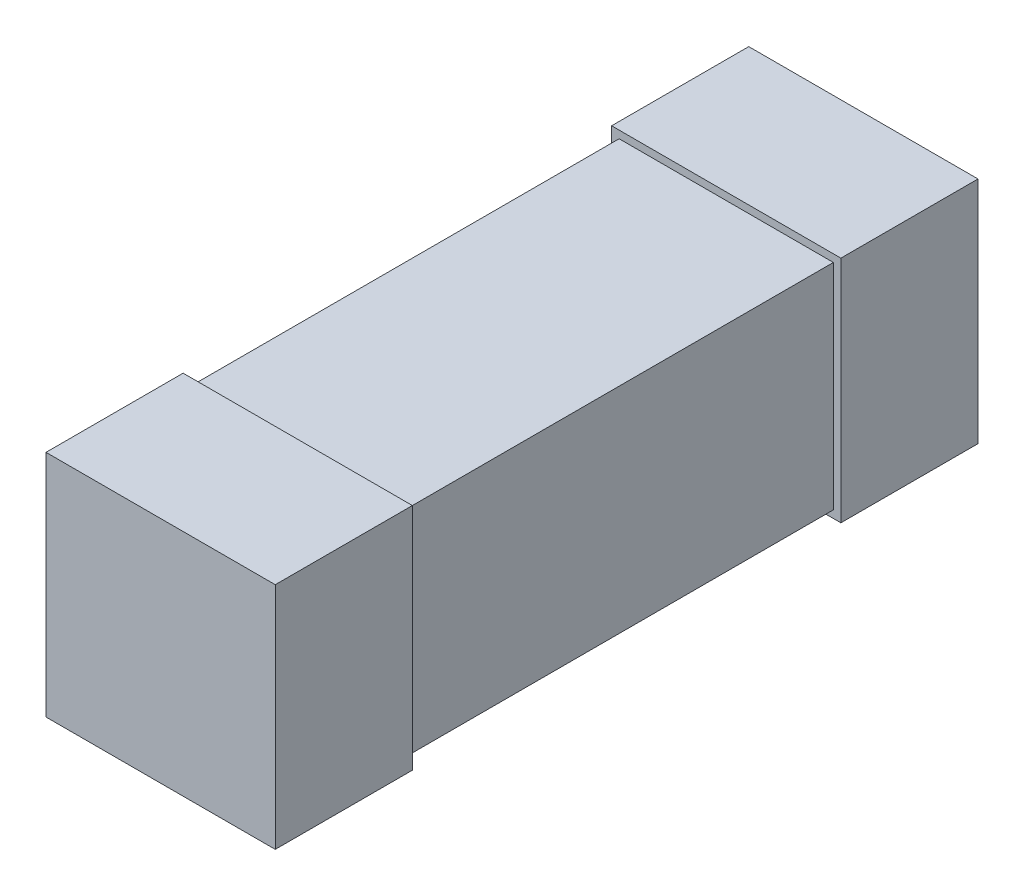
ISO-10303-21;
HEADER;
FILE_DESCRIPTION(('STEP AP214'),'2;1');
FILE_NAME('part.step','',(''),(''),'','','');
FILE_SCHEMA(('AUTOMOTIVE_DESIGN { 1 0 10303 214 1 1 1 1 }'));
ENDSEC;
DATA;
#1=APPLICATION_CONTEXT('core data for automotive mechanical design processes');
#2=APPLICATION_PROTOCOL_DEFINITION('international standard','automotive_design',2000,#1);
#3=PRODUCT_CONTEXT('',#1,'mechanical');
#4=PRODUCT('Part','Part','',(#3));
#5=PRODUCT_RELATED_PRODUCT_CATEGORY('part','',(#4));
#6=PRODUCT_DEFINITION_FORMATION('','',#4);
#7=PRODUCT_DEFINITION_CONTEXT('part definition',#1,'design');
#8=PRODUCT_DEFINITION('design','',#6,#7);
#9=PRODUCT_DEFINITION_SHAPE('','',#8);
#10=(LENGTH_UNIT() NAMED_UNIT(*) SI_UNIT(.MILLI.,.METRE.));
#11=(NAMED_UNIT(*) PLANE_ANGLE_UNIT() SI_UNIT($,.RADIAN.));
#12=(NAMED_UNIT(*) SI_UNIT($,.STERADIAN.) SOLID_ANGLE_UNIT());
#13=UNCERTAINTY_MEASURE_WITH_UNIT(LENGTH_MEASURE(1.E-05),#10,'distance_accuracy_value','');
#14=(GEOMETRIC_REPRESENTATION_CONTEXT(3) GLOBAL_UNCERTAINTY_ASSIGNED_CONTEXT((#13)) GLOBAL_UNIT_ASSIGNED_CONTEXT((#10,
#11,#12)) REPRESENTATION_CONTEXT('',''));
#15=CARTESIAN_POINT('',(0.,0.,0.));
#16=DIRECTION('',(0.,0.,1.));
#17=DIRECTION('',(1.,0.,0.));
#18=AXIS2_PLACEMENT_3D('',#15,#16,#17);
#19=CARTESIAN_POINT('',(0.,0.,3.2));
#20=DIRECTION('',(0.,0.,1.));
#21=DIRECTION('',(1.,0.,0.));
#22=AXIS2_PLACEMENT_3D('',#19,#20,#21);
#23=PLANE('',#22);
#24=DIRECTION('',(0.,1.,0.));
#25=VECTOR('',#24,1.);
#26=CARTESIAN_POINT('',(0.,0.,3.2));
#27=LINE('',#26,#25);
#28=CARTESIAN_POINT('',(0.,0.,3.2));
#29=VERTEX_POINT('',#28);
#30=CARTESIAN_POINT('',(0.,5.35,3.2));
#31=VERTEX_POINT('',#30);
#32=EDGE_CURVE('E192',#29,#31,#27,.T.);
#33=ORIENTED_EDGE('',*,*,#32,.T.);
#34=DIRECTION('',(-1.,0.,0.));
#35=VECTOR('',#34,1.);
#36=CARTESIAN_POINT('',(0.,5.35,3.2));
#37=LINE('',#36,#35);
#38=CARTESIAN_POINT('',(-5.35,5.35,3.2));
#39=VERTEX_POINT('',#38);
#40=EDGE_CURVE('E85',#31,#39,#37,.T.);
#41=ORIENTED_EDGE('',*,*,#40,.T.);
#42=DIRECTION('',(0.,-1.,0.));
#43=VECTOR('',#42,1.);
#44=CARTESIAN_POINT('',(-5.35,0.,3.2));
#45=LINE('',#44,#43);
#46=CARTESIAN_POINT('',(-5.35,0.,3.2));
#47=VERTEX_POINT('',#46);
#48=EDGE_CURVE('E195',#39,#47,#45,.T.);
#49=ORIENTED_EDGE('',*,*,#48,.T.);
#50=DIRECTION('',(1.,0.,0.));
#51=VECTOR('',#50,1.);
#52=CARTESIAN_POINT('',(0.,0.,3.2));
#53=LINE('',#52,#51);
#54=EDGE_CURVE('E57',#47,#29,#53,.T.);
#55=ORIENTED_EDGE('',*,*,#54,.T.);
#56=EDGE_LOOP('',(#33,#41,#49,#55));
#57=FACE_BOUND('',#56,.T.);
#58=DIRECTION('',(1.,0.,0.));
#59=VECTOR('',#58,1.);
#60=CARTESIAN_POINT('',(-0.174999999999999,0.174999999999999,3.2));
#61=LINE('',#60,#59);
#62=CARTESIAN_POINT('',(-5.175,0.174999999999998,3.2));
#63=VERTEX_POINT('',#62);
#64=CARTESIAN_POINT('',(-0.174999999999999,0.174999999999999,3.2));
#65=VERTEX_POINT('',#64);
#66=EDGE_CURVE('E159',#63,#65,#61,.T.);
#67=ORIENTED_EDGE('',*,*,#66,.F.);
#68=DIRECTION('',(0.,-1.,0.));
#69=VECTOR('',#68,1.);
#70=CARTESIAN_POINT('',(-5.175,5.175,3.2));
#71=LINE('',#70,#69);
#72=CARTESIAN_POINT('',(-5.175,5.175,3.2));
#73=VERTEX_POINT('',#72);
#74=EDGE_CURVE('E156',#73,#63,#71,.T.);
#75=ORIENTED_EDGE('',*,*,#74,.F.);
#76=DIRECTION('',(-1.,0.,0.));
#77=VECTOR('',#76,1.);
#78=CARTESIAN_POINT('',(-0.174999999999999,5.175,3.2));
#79=LINE('',#78,#77);
#80=CARTESIAN_POINT('',(-0.174999999999999,5.175,3.2));
#81=VERTEX_POINT('',#80);
#82=EDGE_CURVE('E169',#81,#73,#79,.T.);
#83=ORIENTED_EDGE('',*,*,#82,.F.);
#84=DIRECTION('',(0.,1.,0.));
#85=VECTOR('',#84,1.);
#86=CARTESIAN_POINT('',(-0.174999999999999,5.175,3.2));
#87=LINE('',#86,#85);
#88=EDGE_CURVE('E180',#65,#81,#87,.T.);
#89=ORIENTED_EDGE('',*,*,#88,.F.);
#90=EDGE_LOOP('',(#67,#75,#83,#89));
#91=FACE_BOUND('',#90,.T.);
#92=ADVANCED_FACE('F33',(#57,#91),#23,.T.);
#93=CARTESIAN_POINT('',(0.,0.,3.2));
#94=DIRECTION('',(-1.,0.,0.));
#95=DIRECTION('',(0.,0.,1.));
#96=AXIS2_PLACEMENT_3D('',#93,#94,#95);
#97=PLANE('',#96);
#98=DIRECTION('',(0.,1.,0.));
#99=VECTOR('',#98,1.);
#100=CARTESIAN_POINT('',(0.,0.,0.));
#101=LINE('',#100,#99);
#102=CARTESIAN_POINT('',(0.,0.,0.));
#103=VERTEX_POINT('',#102);
#104=CARTESIAN_POINT('',(0.,5.35,0.));
#105=VERTEX_POINT('',#104);
#106=EDGE_CURVE('E191',#103,#105,#101,.T.);
#107=ORIENTED_EDGE('',*,*,#106,.T.);
#108=DIRECTION('',(0.,0.,-1.));
#109=VECTOR('',#108,1.);
#110=CARTESIAN_POINT('',(0.,5.35,3.2));
#111=LINE('',#110,#109);
#112=EDGE_CURVE('E11',#31,#105,#111,.T.);
#113=ORIENTED_EDGE('',*,*,#112,.F.);
#114=ORIENTED_EDGE('',*,*,#32,.F.);
#115=DIRECTION('',(0.,0.,-1.));
#116=VECTOR('',#115,1.);
#117=CARTESIAN_POINT('',(0.,0.,3.2));
#118=LINE('',#117,#116);
#119=EDGE_CURVE('E198',#29,#103,#118,.T.);
#120=ORIENTED_EDGE('',*,*,#119,.T.);
#121=EDGE_LOOP('',(#107,#113,#114,#120));
#122=FACE_BOUND('',#121,.T.);
#123=ADVANCED_FACE('F35',(#122),#97,.F.);
#124=CARTESIAN_POINT('',(0.,5.35,3.2));
#125=DIRECTION('',(0.,-1.,0.));
#126=DIRECTION('',(0.,0.,-1.));
#127=AXIS2_PLACEMENT_3D('',#124,#125,#126);
#128=PLANE('',#127);
#129=DIRECTION('',(-1.,0.,0.));
#130=VECTOR('',#129,1.);
#131=CARTESIAN_POINT('',(0.,5.35,0.));
#132=LINE('',#131,#130);
#133=CARTESIAN_POINT('',(-5.35,5.35,0.));
#134=VERTEX_POINT('',#133);
#135=EDGE_CURVE('E201',#105,#134,#132,.T.);
#136=ORIENTED_EDGE('',*,*,#135,.T.);
#137=DIRECTION('',(0.,0.,-1.));
#138=VECTOR('',#137,1.);
#139=CARTESIAN_POINT('',(-5.35,5.35,3.2));
#140=LINE('',#139,#138);
#141=EDGE_CURVE('E41',#39,#134,#140,.T.);
#142=ORIENTED_EDGE('',*,*,#141,.F.);
#143=ORIENTED_EDGE('',*,*,#40,.F.);
#144=ORIENTED_EDGE('',*,*,#112,.T.);
#145=EDGE_LOOP('',(#136,#142,#143,#144));
#146=FACE_BOUND('',#145,.T.);
#147=ADVANCED_FACE('F229',(#146),#128,.F.);
#148=CARTESIAN_POINT('',(-5.35,0.,3.2));
#149=DIRECTION('',(1.,0.,0.));
#150=DIRECTION('',(0.,0.,-1.));
#151=AXIS2_PLACEMENT_3D('',#148,#149,#150);
#152=PLANE('',#151);
#153=DIRECTION('',(0.,-1.,0.));
#154=VECTOR('',#153,1.);
#155=CARTESIAN_POINT('',(-5.35,0.,0.));
#156=LINE('',#155,#154);
#157=CARTESIAN_POINT('',(-5.35,0.,0.));
#158=VERTEX_POINT('',#157);
#159=EDGE_CURVE('E203',#134,#158,#156,.T.);
#160=ORIENTED_EDGE('',*,*,#159,.T.);
#161=DIRECTION('',(0.,0.,-1.));
#162=VECTOR('',#161,1.);
#163=CARTESIAN_POINT('',(-5.35,0.,3.2));
#164=LINE('',#163,#162);
#165=EDGE_CURVE('E207',#47,#158,#164,.T.);
#166=ORIENTED_EDGE('',*,*,#165,.F.);
#167=ORIENTED_EDGE('',*,*,#48,.F.);
#168=ORIENTED_EDGE('',*,*,#141,.T.);
#169=EDGE_LOOP('',(#160,#166,#167,#168));
#170=FACE_BOUND('',#169,.T.);
#171=ADVANCED_FACE('F212',(#170),#152,.F.);
#172=CARTESIAN_POINT('',(0.,0.,3.2));
#173=DIRECTION('',(0.,1.,0.));
#174=DIRECTION('',(-1.,0.,0.));
#175=AXIS2_PLACEMENT_3D('',#172,#173,#174);
#176=PLANE('',#175);
#177=DIRECTION('',(1.,0.,0.));
#178=VECTOR('',#177,1.);
#179=CARTESIAN_POINT('',(0.,0.,0.));
#180=LINE('',#179,#178);
#181=EDGE_CURVE('E78',#158,#103,#180,.T.);
#182=ORIENTED_EDGE('',*,*,#181,.T.);
#183=ORIENTED_EDGE('',*,*,#119,.F.);
#184=ORIENTED_EDGE('',*,*,#54,.F.);
#185=ORIENTED_EDGE('',*,*,#165,.T.);
#186=EDGE_LOOP('',(#182,#183,#184,#185));
#187=FACE_BOUND('',#186,.T.);
#188=ADVANCED_FACE('F220',(#187),#176,.F.);
#189=CARTESIAN_POINT('',(0.,0.,0.));
#190=DIRECTION('',(0.,0.,1.));
#191=DIRECTION('',(1.,0.,0.));
#192=AXIS2_PLACEMENT_3D('',#189,#190,#191);
#193=PLANE('',#192);
#194=ORIENTED_EDGE('',*,*,#106,.F.);
#195=ORIENTED_EDGE('',*,*,#181,.F.);
#196=ORIENTED_EDGE('',*,*,#159,.F.);
#197=ORIENTED_EDGE('',*,*,#135,.F.);
#198=EDGE_LOOP('',(#194,#195,#196,#197));
#199=FACE_BOUND('',#198,.T.);
#200=ADVANCED_FACE('F216',(#199),#193,.F.);
#201=CARTESIAN_POINT('',(-5.175,5.175,13.2));
#202=DIRECTION('',(1.,0.,0.));
#203=DIRECTION('',(0.,0.,-1.));
#204=AXIS2_PLACEMENT_3D('',#201,#202,#203);
#205=PLANE('',#204);
#206=ORIENTED_EDGE('',*,*,#74,.T.);
#207=DIRECTION('',(0.,0.,-1.));
#208=VECTOR('',#207,1.);
#209=CARTESIAN_POINT('',(-5.175,0.174999999999998,13.2));
#210=LINE('',#209,#208);
#211=CARTESIAN_POINT('',(-5.175,0.174999999999998,13.2));
#212=VERTEX_POINT('',#211);
#213=EDGE_CURVE('E189',#212,#63,#210,.T.);
#214=ORIENTED_EDGE('',*,*,#213,.F.);
#215=DIRECTION('',(0.,-1.,0.));
#216=VECTOR('',#215,1.);
#217=CARTESIAN_POINT('',(-5.175,5.175,13.2));
#218=LINE('',#217,#216);
#219=CARTESIAN_POINT('',(-5.175,5.175,13.2));
#220=VERTEX_POINT('',#219);
#221=EDGE_CURVE('E165',#220,#212,#218,.T.);
#222=ORIENTED_EDGE('',*,*,#221,.F.);
#223=DIRECTION('',(0.,0.,-1.));
#224=VECTOR('',#223,1.);
#225=CARTESIAN_POINT('',(-5.175,5.175,13.2));
#226=LINE('',#225,#224);
#227=EDGE_CURVE('E177',#220,#73,#226,.T.);
#228=ORIENTED_EDGE('',*,*,#227,.T.);
#229=EDGE_LOOP('',(#206,#214,#222,#228));
#230=FACE_BOUND('',#229,.T.);
#231=ADVANCED_FACE('F227',(#230),#205,.F.);
#232=CARTESIAN_POINT('',(-0.174999999999999,0.174999999999999,13.2));
#233=DIRECTION('',(0.,1.,0.));
#234=DIRECTION('',(-1.,0.,0.));
#235=AXIS2_PLACEMENT_3D('',#232,#233,#234);
#236=PLANE('',#235);
#237=ORIENTED_EDGE('',*,*,#66,.T.);
#238=DIRECTION('',(0.,0.,-1.));
#239=VECTOR('',#238,1.);
#240=CARTESIAN_POINT('',(-0.174999999999999,0.174999999999999,13.2));
#241=LINE('',#240,#239);
#242=CARTESIAN_POINT('',(-0.174999999999999,0.174999999999999,13.2));
#243=VERTEX_POINT('',#242);
#244=EDGE_CURVE('E186',#243,#65,#241,.T.);
#245=ORIENTED_EDGE('',*,*,#244,.F.);
#246=DIRECTION('',(1.,0.,0.));
#247=VECTOR('',#246,1.);
#248=CARTESIAN_POINT('',(-0.174999999999999,0.174999999999999,13.2));
#249=LINE('',#248,#247);
#250=EDGE_CURVE('E168',#212,#243,#249,.T.);
#251=ORIENTED_EDGE('',*,*,#250,.F.);
#252=ORIENTED_EDGE('',*,*,#213,.T.);
#253=EDGE_LOOP('',(#237,#245,#251,#252));
#254=FACE_BOUND('',#253,.T.);
#255=ADVANCED_FACE('F240',(#254),#236,.F.);
#256=CARTESIAN_POINT('',(-0.174999999999999,5.175,13.2));
#257=DIRECTION('',(-1.,0.,0.));
#258=DIRECTION('',(0.,-1.,0.));
#259=AXIS2_PLACEMENT_3D('',#256,#257,#258);
#260=PLANE('',#259);
#261=ORIENTED_EDGE('',*,*,#88,.T.);
#262=DIRECTION('',(0.,0.,-1.));
#263=VECTOR('',#262,1.);
#264=CARTESIAN_POINT('',(-0.174999999999999,5.175,13.2));
#265=LINE('',#264,#263);
#266=CARTESIAN_POINT('',(-0.174999999999999,5.175,13.2));
#267=VERTEX_POINT('',#266);
#268=EDGE_CURVE('E48',#267,#81,#265,.T.);
#269=ORIENTED_EDGE('',*,*,#268,.F.);
#270=DIRECTION('',(0.,1.,0.));
#271=VECTOR('',#270,1.);
#272=CARTESIAN_POINT('',(-0.174999999999999,5.175,13.2));
#273=LINE('',#272,#271);
#274=EDGE_CURVE('E172',#243,#267,#273,.T.);
#275=ORIENTED_EDGE('',*,*,#274,.F.);
#276=ORIENTED_EDGE('',*,*,#244,.T.);
#277=EDGE_LOOP('',(#261,#269,#275,#276));
#278=FACE_BOUND('',#277,.T.);
#279=ADVANCED_FACE('F244',(#278),#260,.F.);
#280=CARTESIAN_POINT('',(-0.174999999999999,5.175,13.2));
#281=DIRECTION('',(0.,-1.,0.));
#282=DIRECTION('',(1.,0.,0.));
#283=AXIS2_PLACEMENT_3D('',#280,#281,#282);
#284=PLANE('',#283);
#285=ORIENTED_EDGE('',*,*,#82,.T.);
#286=ORIENTED_EDGE('',*,*,#227,.F.);
#287=DIRECTION('',(-1.,0.,0.));
#288=VECTOR('',#287,1.);
#289=CARTESIAN_POINT('',(-0.174999999999999,5.175,13.2));
#290=LINE('',#289,#288);
#291=EDGE_CURVE('E175',#267,#220,#290,.T.);
#292=ORIENTED_EDGE('',*,*,#291,.F.);
#293=ORIENTED_EDGE('',*,*,#268,.T.);
#294=EDGE_LOOP('',(#285,#286,#292,#293));
#295=FACE_BOUND('',#294,.T.);
#296=ADVANCED_FACE('F248',(#295),#284,.F.);
#297=CARTESIAN_POINT('',(0.,0.,13.2));
#298=DIRECTION('',(0.,0.,-1.));
#299=DIRECTION('',(-1.,0.,0.));
#300=AXIS2_PLACEMENT_3D('',#297,#298,#299);
#301=PLANE('',#300);
#302=DIRECTION('',(0.,-1.,0.));
#303=VECTOR('',#302,1.);
#304=CARTESIAN_POINT('',(-5.35,5.35,13.2));
#305=LINE('',#304,#303);
#306=CARTESIAN_POINT('',(-5.35,5.35,13.2));
#307=VERTEX_POINT('',#306);
#308=CARTESIAN_POINT('',(-5.35,0.,13.2));
#309=VERTEX_POINT('',#308);
#310=EDGE_CURVE('E155',#307,#309,#305,.T.);
#311=ORIENTED_EDGE('',*,*,#310,.F.);
#312=DIRECTION('',(-1.,0.,0.));
#313=VECTOR('',#312,1.);
#314=CARTESIAN_POINT('',(0.,5.35,13.2));
#315=LINE('',#314,#313);
#316=CARTESIAN_POINT('',(0.,5.35,13.2));
#317=VERTEX_POINT('',#316);
#318=EDGE_CURVE('E151',#317,#307,#315,.T.);
#319=ORIENTED_EDGE('',*,*,#318,.F.);
#320=DIRECTION('',(0.,1.,0.));
#321=VECTOR('',#320,1.);
#322=CARTESIAN_POINT('',(0.,5.35,13.2));
#323=LINE('',#322,#321);
#324=CARTESIAN_POINT('',(0.,0.,13.2));
#325=VERTEX_POINT('',#324);
#326=EDGE_CURVE('E374',#325,#317,#323,.T.);
#327=ORIENTED_EDGE('',*,*,#326,.F.);
#328=DIRECTION('',(1.,0.,0.));
#329=VECTOR('',#328,1.);
#330=CARTESIAN_POINT('',(0.,0.,13.2));
#331=LINE('',#330,#329);
#332=EDGE_CURVE('E372',#309,#325,#331,.T.);
#333=ORIENTED_EDGE('',*,*,#332,.F.);
#334=EDGE_LOOP('',(#311,#319,#327,#333));
#335=FACE_BOUND('',#334,.T.);
#336=ORIENTED_EDGE('',*,*,#221,.T.);
#337=ORIENTED_EDGE('',*,*,#250,.T.);
#338=ORIENTED_EDGE('',*,*,#274,.T.);
#339=ORIENTED_EDGE('',*,*,#291,.T.);
#340=EDGE_LOOP('',(#336,#337,#338,#339));
#341=FACE_BOUND('',#340,.T.);
#342=ADVANCED_FACE('F252',(#335,#341),#301,.T.);
#343=CARTESIAN_POINT('',(-5.35,5.35,16.4));
#344=DIRECTION('',(1.,0.,0.));
#345=DIRECTION('',(0.,1.,0.));
#346=AXIS2_PLACEMENT_3D('',#343,#344,#345);
#347=PLANE('',#346);
#348=ORIENTED_EDGE('',*,*,#310,.T.);
#349=DIRECTION('',(0.,0.,-1.));
#350=VECTOR('',#349,1.);
#351=CARTESIAN_POINT('',(-5.35,0.,16.4));
#352=LINE('',#351,#350);
#353=CARTESIAN_POINT('',(-5.35,0.,16.4));
#354=VERTEX_POINT('',#353);
#355=EDGE_CURVE('E135',#354,#309,#352,.T.);
#356=ORIENTED_EDGE('',*,*,#355,.F.);
#357=DIRECTION('',(0.,-1.,0.));
#358=VECTOR('',#357,1.);
#359=CARTESIAN_POINT('',(-5.35,5.35,16.4));
#360=LINE('',#359,#358);
#361=CARTESIAN_POINT('',(-5.35,5.35,16.4));
#362=VERTEX_POINT('',#361);
#363=EDGE_CURVE('E142',#362,#354,#360,.T.);
#364=ORIENTED_EDGE('',*,*,#363,.F.);
#365=DIRECTION('',(0.,0.,-1.));
#366=VECTOR('',#365,1.);
#367=CARTESIAN_POINT('',(-5.35,5.35,16.4));
#368=LINE('',#367,#366);
#369=EDGE_CURVE('E381',#362,#307,#368,.T.);
#370=ORIENTED_EDGE('',*,*,#369,.T.);
#371=EDGE_LOOP('',(#348,#356,#364,#370));
#372=FACE_BOUND('',#371,.T.);
#373=ADVANCED_FACE('F153',(#372),#347,.F.);
#374=CARTESIAN_POINT('',(0.,0.,16.4));
#375=DIRECTION('',(0.,1.,0.));
#376=DIRECTION('',(-1.,0.,0.));
#377=AXIS2_PLACEMENT_3D('',#374,#375,#376);
#378=PLANE('',#377);
#379=ORIENTED_EDGE('',*,*,#332,.T.);
#380=DIRECTION('',(0.,0.,-1.));
#381=VECTOR('',#380,1.);
#382=CARTESIAN_POINT('',(0.,0.,16.4));
#383=LINE('',#382,#381);
#384=CARTESIAN_POINT('',(0.,0.,16.4));
#385=VERTEX_POINT('',#384);
#386=EDGE_CURVE('E138',#385,#325,#383,.T.);
#387=ORIENTED_EDGE('',*,*,#386,.F.);
#388=DIRECTION('',(1.,0.,0.));
#389=VECTOR('',#388,1.);
#390=CARTESIAN_POINT('',(0.,0.,16.4));
#391=LINE('',#390,#389);
#392=EDGE_CURVE('E131',#354,#385,#391,.T.);
#393=ORIENTED_EDGE('',*,*,#392,.F.);
#394=ORIENTED_EDGE('',*,*,#355,.T.);
#395=EDGE_LOOP('',(#379,#387,#393,#394));
#396=FACE_BOUND('',#395,.T.);
#397=ADVANCED_FACE('F133',(#396),#378,.F.);
#398=CARTESIAN_POINT('',(0.,5.35,16.4));
#399=DIRECTION('',(-1.,0.,0.));
#400=DIRECTION('',(0.,-1.,0.));
#401=AXIS2_PLACEMENT_3D('',#398,#399,#400);
#402=PLANE('',#401);
#403=ORIENTED_EDGE('',*,*,#326,.T.);
#404=DIRECTION('',(0.,0.,-1.));
#405=VECTOR('',#404,1.);
#406=CARTESIAN_POINT('',(0.,5.35,16.4));
#407=LINE('',#406,#405);
#408=CARTESIAN_POINT('',(0.,5.35,16.4));
#409=VERTEX_POINT('',#408);
#410=EDGE_CURVE('E161',#409,#317,#407,.T.);
#411=ORIENTED_EDGE('',*,*,#410,.F.);
#412=DIRECTION('',(0.,1.,0.));
#413=VECTOR('',#412,1.);
#414=CARTESIAN_POINT('',(0.,5.35,16.4));
#415=LINE('',#414,#413);
#416=EDGE_CURVE('E141',#385,#409,#415,.T.);
#417=ORIENTED_EDGE('',*,*,#416,.F.);
#418=ORIENTED_EDGE('',*,*,#386,.T.);
#419=EDGE_LOOP('',(#403,#411,#417,#418));
#420=FACE_BOUND('',#419,.T.);
#421=ADVANCED_FACE('F257',(#420),#402,.F.);
#422=CARTESIAN_POINT('',(0.,5.35,16.4));
#423=DIRECTION('',(0.,-1.,0.));
#424=DIRECTION('',(1.,0.,0.));
#425=AXIS2_PLACEMENT_3D('',#422,#423,#424);
#426=PLANE('',#425);
#427=ORIENTED_EDGE('',*,*,#318,.T.);
#428=ORIENTED_EDGE('',*,*,#369,.F.);
#429=DIRECTION('',(-1.,0.,0.));
#430=VECTOR('',#429,1.);
#431=CARTESIAN_POINT('',(0.,5.35,16.4));
#432=LINE('',#431,#430);
#433=EDGE_CURVE('E147',#409,#362,#432,.T.);
#434=ORIENTED_EDGE('',*,*,#433,.F.);
#435=ORIENTED_EDGE('',*,*,#410,.T.);
#436=EDGE_LOOP('',(#427,#428,#434,#435));
#437=FACE_BOUND('',#436,.T.);
#438=ADVANCED_FACE('F260',(#437),#426,.F.);
#439=CARTESIAN_POINT('',(0.,0.,16.4));
#440=DIRECTION('',(0.,0.,-1.));
#441=DIRECTION('',(-1.,0.,0.));
#442=AXIS2_PLACEMENT_3D('',#439,#440,#441);
#443=PLANE('',#442);
#444=ORIENTED_EDGE('',*,*,#363,.T.);
#445=ORIENTED_EDGE('',*,*,#392,.T.);
#446=ORIENTED_EDGE('',*,*,#416,.T.);
#447=ORIENTED_EDGE('',*,*,#433,.T.);
#448=EDGE_LOOP('',(#444,#445,#446,#447));
#449=FACE_BOUND('',#448,.T.);
#450=ADVANCED_FACE('F145',(#449),#443,.F.);
#451=CLOSED_SHELL('',(#92,#123,#147,#171,#188,#200,#231,#255,#279,#296,#342,#373,#397,#421,#438,#450));
#452=MANIFOLD_SOLID_BREP('B2',#451);
#453=ADVANCED_BREP_SHAPE_REPRESENTATION('',(#18,#452),#14);
#454=SHAPE_DEFINITION_REPRESENTATION(#9,#453);
ENDSEC;
END-ISO-10303-21;
